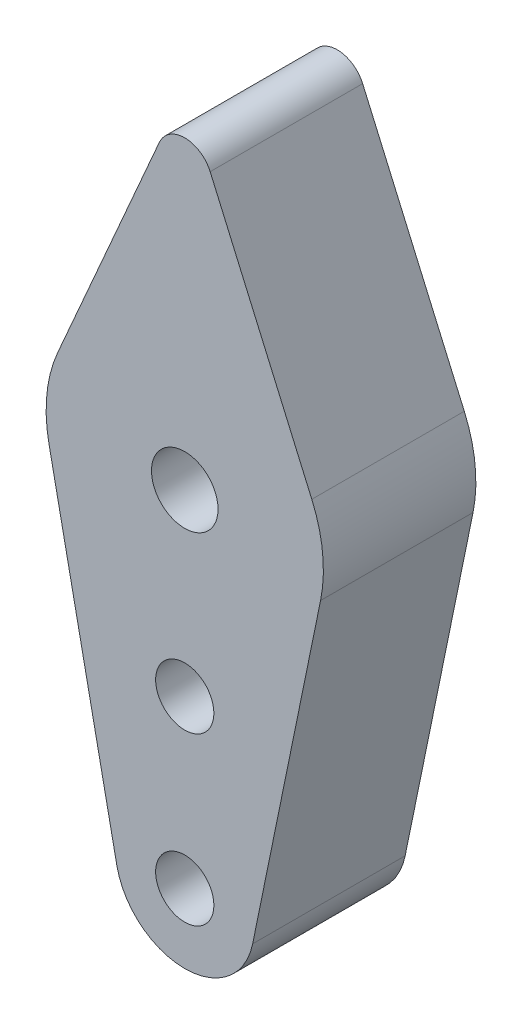
ISO-10303-21;
HEADER;
FILE_DESCRIPTION(('STEP AP214'),'2;1');
FILE_NAME('part.step','',(''),(''),'','','');
FILE_SCHEMA(('AUTOMOTIVE_DESIGN { 1 0 10303 214 1 1 1 1 }'));
ENDSEC;
DATA;
#1=APPLICATION_CONTEXT('core data for automotive mechanical design processes');
#2=APPLICATION_PROTOCOL_DEFINITION('international standard','automotive_design',2000,#1);
#3=PRODUCT_CONTEXT('',#1,'mechanical');
#4=PRODUCT('Part','Part','',(#3));
#5=PRODUCT_RELATED_PRODUCT_CATEGORY('part','',(#4));
#6=PRODUCT_DEFINITION_FORMATION('','',#4);
#7=PRODUCT_DEFINITION_CONTEXT('part definition',#1,'design');
#8=PRODUCT_DEFINITION('design','',#6,#7);
#9=PRODUCT_DEFINITION_SHAPE('','',#8);
#10=(LENGTH_UNIT() NAMED_UNIT(*) SI_UNIT(.MILLI.,.METRE.));
#11=(NAMED_UNIT(*) PLANE_ANGLE_UNIT() SI_UNIT($,.RADIAN.));
#12=(NAMED_UNIT(*) SI_UNIT($,.STERADIAN.) SOLID_ANGLE_UNIT());
#13=UNCERTAINTY_MEASURE_WITH_UNIT(LENGTH_MEASURE(1.E-05),#10,'distance_accuracy_value','');
#14=(GEOMETRIC_REPRESENTATION_CONTEXT(3) GLOBAL_UNCERTAINTY_ASSIGNED_CONTEXT((#13)) GLOBAL_UNIT_ASSIGNED_CONTEXT((#10,
#11,#12)) REPRESENTATION_CONTEXT('',''));
#15=CARTESIAN_POINT('',(0.,0.,0.));
#16=DIRECTION('',(0.,0.,1.));
#17=DIRECTION('',(1.,0.,0.));
#18=AXIS2_PLACEMENT_3D('',#15,#16,#17);
#19=CARTESIAN_POINT('',(0.,0.,5.5));
#20=DIRECTION('',(0.,0.,1.));
#21=DIRECTION('',(1.,0.,0.));
#22=AXIS2_PLACEMENT_3D('',#19,#20,#21);
#23=PLANE('',#22);
#24=CARTESIAN_POINT('',(0.,-12.45,5.5));
#25=DIRECTION('',(0.,0.,1.));
#26=DIRECTION('',(1.,0.,0.));
#27=AXIS2_PLACEMENT_3D('',#24,#25,#26);
#28=CIRCLE('',#27,1.05);
#29=CARTESIAN_POINT('',(1.05,-12.45,5.5));
#30=VERTEX_POINT('',#29);
#31=EDGE_CURVE('E184',#30,#30,#28,.T.);
#32=ORIENTED_EDGE('',*,*,#31,.F.);
#33=EDGE_LOOP('',(#32));
#34=FACE_BOUND('',#33,.T.);
#35=CARTESIAN_POINT('',(0.,0.,5.5));
#36=DIRECTION('',(0.,0.,1.));
#37=DIRECTION('',(1.,0.,0.));
#38=AXIS2_PLACEMENT_3D('',#35,#36,#37);
#39=CIRCLE('',#38,5.);
#40=CARTESIAN_POINT('',(-4.58257569495584,2.,5.5));
#41=VERTEX_POINT('',#40);
#42=CARTESIAN_POINT('',(-4.8981579948705,-1.00401606425703,5.5));
#43=VERTEX_POINT('',#42);
#44=EDGE_CURVE('E147',#41,#43,#39,.T.);
#45=ORIENTED_EDGE('',*,*,#44,.T.);
#46=DIRECTION('',(0.200803212851406,-0.979631598974101,0.));
#47=VECTOR('',#46,1.);
#48=CARTESIAN_POINT('',(-2.44907899743525,-12.9520080321285,5.5));
#49=LINE('',#48,#47);
#50=CARTESIAN_POINT('',(-2.44907899743525,-12.9520080321285,5.5));
#51=VERTEX_POINT('',#50);
#52=EDGE_CURVE('E95',#43,#51,#49,.T.);
#53=ORIENTED_EDGE('',*,*,#52,.T.);
#54=CARTESIAN_POINT('',(0.,-12.45,5.5));
#55=DIRECTION('',(0.,0.,1.));
#56=DIRECTION('',(1.,0.,0.));
#57=AXIS2_PLACEMENT_3D('',#54,#55,#56);
#58=CIRCLE('',#57,2.5);
#59=CARTESIAN_POINT('',(2.44907899743525,-12.9520080321285,5.5));
#60=VERTEX_POINT('',#59);
#61=EDGE_CURVE('E162',#51,#60,#58,.T.);
#62=ORIENTED_EDGE('',*,*,#61,.T.);
#63=DIRECTION('',(0.200803212851406,0.979631598974101,0.));
#64=VECTOR('',#63,1.);
#65=CARTESIAN_POINT('',(2.44907899743525,-12.9520080321285,5.5));
#66=LINE('',#65,#64);
#67=CARTESIAN_POINT('',(4.8981579948705,-1.00401606425703,5.5));
#68=VERTEX_POINT('',#67);
#69=EDGE_CURVE('E175',#60,#68,#66,.T.);
#70=ORIENTED_EDGE('',*,*,#69,.T.);
#71=CARTESIAN_POINT('',(0.,0.,5.5));
#72=DIRECTION('',(0.,0.,1.));
#73=DIRECTION('',(1.,0.,0.));
#74=AXIS2_PLACEMENT_3D('',#71,#72,#73);
#75=CIRCLE('',#74,5.);
#76=CARTESIAN_POINT('',(4.58257569495584,2.,5.5));
#77=VERTEX_POINT('',#76);
#78=EDGE_CURVE('E114',#68,#77,#75,.T.);
#79=ORIENTED_EDGE('',*,*,#78,.T.);
#80=DIRECTION('',(-0.4,0.916515138991168,0.));
#81=VECTOR('',#80,1.);
#82=CARTESIAN_POINT('',(4.58257569495584,2.,5.5));
#83=LINE('',#82,#81);
#84=CARTESIAN_POINT('',(0.916515138991168,10.4,5.5));
#85=VERTEX_POINT('',#84);
#86=EDGE_CURVE('E108',#77,#85,#83,.T.);
#87=ORIENTED_EDGE('',*,*,#86,.T.);
#88=CARTESIAN_POINT('',(0.,10.,5.5));
#89=DIRECTION('',(0.,0.,1.));
#90=DIRECTION('',(-1.,0.,0.));
#91=AXIS2_PLACEMENT_3D('',#88,#89,#90);
#92=CIRCLE('',#91,1.);
#93=CARTESIAN_POINT('',(-0.916515138991168,10.4,5.5));
#94=VERTEX_POINT('',#93);
#95=EDGE_CURVE('E112',#85,#94,#92,.T.);
#96=ORIENTED_EDGE('',*,*,#95,.T.);
#97=DIRECTION('',(-0.4,-0.916515138991168,0.));
#98=VECTOR('',#97,1.);
#99=CARTESIAN_POINT('',(-4.58257569495584,2.,5.5));
#100=LINE('',#99,#98);
#101=EDGE_CURVE('E52',#94,#41,#100,.T.);
#102=ORIENTED_EDGE('',*,*,#101,.T.);
#103=EDGE_LOOP('',(#45,#53,#62,#70,#79,#87,#96,#102));
#104=FACE_BOUND('',#103,.T.);
#105=CARTESIAN_POINT('',(0.,-6.45,5.5));
#106=DIRECTION('',(0.,0.,1.));
#107=DIRECTION('',(1.,0.,0.));
#108=AXIS2_PLACEMENT_3D('',#105,#106,#107);
#109=CIRCLE('',#108,1.05);
#110=CARTESIAN_POINT('',(1.05,-6.45,5.5));
#111=VERTEX_POINT('',#110);
#112=EDGE_CURVE('E136',#111,#111,#109,.T.);
#113=ORIENTED_EDGE('',*,*,#112,.F.);
#114=EDGE_LOOP('',(#113));
#115=FACE_BOUND('',#114,.T.);
#116=CARTESIAN_POINT('',(0.,0.,5.5));
#117=DIRECTION('',(0.,0.,1.));
#118=DIRECTION('',(1.,0.,0.));
#119=AXIS2_PLACEMENT_3D('',#116,#117,#118);
#120=CIRCLE('',#119,1.2);
#121=CARTESIAN_POINT('',(1.2,0.,5.5));
#122=VERTEX_POINT('',#121);
#123=EDGE_CURVE('E190',#122,#122,#120,.T.);
#124=ORIENTED_EDGE('',*,*,#123,.F.);
#125=EDGE_LOOP('',(#124));
#126=FACE_BOUND('',#125,.T.);
#127=ADVANCED_FACE('F35',(#34,#104,#115,#126),#23,.T.);
#128=CARTESIAN_POINT('',(0.,0.,0.));
#129=DIRECTION('',(0.,0.,1.));
#130=DIRECTION('',(1.,0.,0.));
#131=AXIS2_PLACEMENT_3D('',#128,#129,#130);
#132=PLANE('',#131);
#133=CARTESIAN_POINT('',(0.,0.,0.));
#134=DIRECTION('',(0.,0.,1.));
#135=DIRECTION('',(1.,0.,0.));
#136=AXIS2_PLACEMENT_3D('',#133,#134,#135);
#137=CIRCLE('',#136,5.);
#138=CARTESIAN_POINT('',(-4.58257569495584,2.,0.));
#139=VERTEX_POINT('',#138);
#140=CARTESIAN_POINT('',(-4.8981579948705,-1.00401606425703,0.));
#141=VERTEX_POINT('',#140);
#142=EDGE_CURVE('E132',#139,#141,#137,.T.);
#143=ORIENTED_EDGE('',*,*,#142,.F.);
#144=DIRECTION('',(-0.4,-0.916515138991168,0.));
#145=VECTOR('',#144,1.);
#146=CARTESIAN_POINT('',(-4.58257569495584,2.,0.));
#147=LINE('',#146,#145);
#148=CARTESIAN_POINT('',(-0.916515138991168,10.4,0.));
#149=VERTEX_POINT('',#148);
#150=EDGE_CURVE('E87',#149,#139,#147,.T.);
#151=ORIENTED_EDGE('',*,*,#150,.F.);
#152=CARTESIAN_POINT('',(0.,10.,0.));
#153=DIRECTION('',(0.,0.,1.));
#154=DIRECTION('',(-1.,0.,0.));
#155=AXIS2_PLACEMENT_3D('',#152,#153,#154);
#156=CIRCLE('',#155,1.);
#157=CARTESIAN_POINT('',(0.916515138991168,10.4,0.));
#158=VERTEX_POINT('',#157);
#159=EDGE_CURVE('E81',#158,#149,#156,.T.);
#160=ORIENTED_EDGE('',*,*,#159,.F.);
#161=DIRECTION('',(-0.4,0.916515138991168,0.));
#162=VECTOR('',#161,1.);
#163=CARTESIAN_POINT('',(4.58257569495584,2.,0.));
#164=LINE('',#163,#162);
#165=CARTESIAN_POINT('',(4.58257569495584,2.,0.));
#166=VERTEX_POINT('',#165);
#167=EDGE_CURVE('E122',#166,#158,#164,.T.);
#168=ORIENTED_EDGE('',*,*,#167,.F.);
#169=CARTESIAN_POINT('',(0.,0.,0.));
#170=DIRECTION('',(0.,0.,1.));
#171=DIRECTION('',(1.,0.,0.));
#172=AXIS2_PLACEMENT_3D('',#169,#170,#171);
#173=CIRCLE('',#172,5.);
#174=CARTESIAN_POINT('',(4.8981579948705,-1.00401606425703,0.));
#175=VERTEX_POINT('',#174);
#176=EDGE_CURVE('E142',#175,#166,#173,.T.);
#177=ORIENTED_EDGE('',*,*,#176,.F.);
#178=DIRECTION('',(0.200803212851406,0.979631598974101,0.));
#179=VECTOR('',#178,1.);
#180=CARTESIAN_POINT('',(2.44907899743525,-12.9520080321285,0.));
#181=LINE('',#180,#179);
#182=CARTESIAN_POINT('',(2.44907899743525,-12.9520080321285,0.));
#183=VERTEX_POINT('',#182);
#184=EDGE_CURVE('E140',#183,#175,#181,.T.);
#185=ORIENTED_EDGE('',*,*,#184,.F.);
#186=CARTESIAN_POINT('',(0.,-12.45,0.));
#187=DIRECTION('',(0.,0.,1.));
#188=DIRECTION('',(1.,0.,0.));
#189=AXIS2_PLACEMENT_3D('',#186,#187,#188);
#190=CIRCLE('',#189,2.5);
#191=CARTESIAN_POINT('',(-2.44907899743525,-12.9520080321285,0.));
#192=VERTEX_POINT('',#191);
#193=EDGE_CURVE('E138',#192,#183,#190,.T.);
#194=ORIENTED_EDGE('',*,*,#193,.F.);
#195=DIRECTION('',(0.200803212851406,-0.979631598974101,0.));
#196=VECTOR('',#195,1.);
#197=CARTESIAN_POINT('',(-2.44907899743525,-12.9520080321285,0.));
#198=LINE('',#197,#196);
#199=EDGE_CURVE('E135',#141,#192,#198,.T.);
#200=ORIENTED_EDGE('',*,*,#199,.F.);
#201=EDGE_LOOP('',(#143,#151,#160,#168,#177,#185,#194,#200));
#202=FACE_BOUND('',#201,.T.);
#203=CARTESIAN_POINT('',(0.,-6.45,0.));
#204=DIRECTION('',(0.,0.,1.));
#205=DIRECTION('',(1.,0.,0.));
#206=AXIS2_PLACEMENT_3D('',#203,#204,#205);
#207=CIRCLE('',#206,1.05);
#208=CARTESIAN_POINT('',(1.05,-6.45,0.));
#209=VERTEX_POINT('',#208);
#210=EDGE_CURVE('E181',#209,#209,#207,.T.);
#211=ORIENTED_EDGE('',*,*,#210,.T.);
#212=EDGE_LOOP('',(#211));
#213=FACE_BOUND('',#212,.T.);
#214=CARTESIAN_POINT('',(0.,-12.45,0.));
#215=DIRECTION('',(0.,0.,1.));
#216=DIRECTION('',(1.,0.,0.));
#217=AXIS2_PLACEMENT_3D('',#214,#215,#216);
#218=CIRCLE('',#217,1.05);
#219=CARTESIAN_POINT('',(1.05,-12.45,0.));
#220=VERTEX_POINT('',#219);
#221=EDGE_CURVE('E187',#220,#220,#218,.T.);
#222=ORIENTED_EDGE('',*,*,#221,.T.);
#223=EDGE_LOOP('',(#222));
#224=FACE_BOUND('',#223,.T.);
#225=CARTESIAN_POINT('',(0.,0.,0.));
#226=DIRECTION('',(0.,0.,1.));
#227=DIRECTION('',(1.,0.,0.));
#228=AXIS2_PLACEMENT_3D('',#225,#226,#227);
#229=CIRCLE('',#228,1.2);
#230=CARTESIAN_POINT('',(1.2,0.,0.));
#231=VERTEX_POINT('',#230);
#232=EDGE_CURVE('E193',#231,#231,#229,.T.);
#233=ORIENTED_EDGE('',*,*,#232,.T.);
#234=EDGE_LOOP('',(#233));
#235=FACE_BOUND('',#234,.T.);
#236=ADVANCED_FACE('F166',(#202,#213,#224,#235),#132,.F.);
#237=CARTESIAN_POINT('',(0.,0.,5.5));
#238=DIRECTION('',(0.,0.,-1.));
#239=DIRECTION('',(-1.,0.,0.));
#240=AXIS2_PLACEMENT_3D('',#237,#238,#239);
#241=CYLINDRICAL_SURFACE('',#240,5.);
#242=ORIENTED_EDGE('',*,*,#142,.T.);
#243=DIRECTION('',(0.,0.,-1.));
#244=VECTOR('',#243,1.);
#245=CARTESIAN_POINT('',(-4.8981579948705,-1.00401606425703,5.5));
#246=LINE('',#245,#244);
#247=EDGE_CURVE('E11',#43,#141,#246,.T.);
#248=ORIENTED_EDGE('',*,*,#247,.F.);
#249=ORIENTED_EDGE('',*,*,#44,.F.);
#250=DIRECTION('',(0.,0.,-1.));
#251=VECTOR('',#250,1.);
#252=CARTESIAN_POINT('',(-4.58257569495584,2.,5.5));
#253=LINE('',#252,#251);
#254=EDGE_CURVE('E128',#41,#139,#253,.T.);
#255=ORIENTED_EDGE('',*,*,#254,.T.);
#256=EDGE_LOOP('',(#242,#248,#249,#255));
#257=FACE_BOUND('',#256,.T.);
#258=ADVANCED_FACE('F37',(#257),#241,.T.);
#259=CARTESIAN_POINT('',(-2.44907899743525,-12.9520080321285,5.5));
#260=DIRECTION('',(0.979631598974101,0.200803212851406,0.));
#261=DIRECTION('',(-0.200803212851406,0.979631598974101,0.));
#262=AXIS2_PLACEMENT_3D('',#259,#260,#261);
#263=PLANE('',#262);
#264=ORIENTED_EDGE('',*,*,#199,.T.);
#265=DIRECTION('',(0.,0.,-1.));
#266=VECTOR('',#265,1.);
#267=CARTESIAN_POINT('',(-2.44907899743525,-12.9520080321285,5.5));
#268=LINE('',#267,#266);
#269=EDGE_CURVE('E44',#51,#192,#268,.T.);
#270=ORIENTED_EDGE('',*,*,#269,.F.);
#271=ORIENTED_EDGE('',*,*,#52,.F.);
#272=ORIENTED_EDGE('',*,*,#247,.T.);
#273=EDGE_LOOP('',(#264,#270,#271,#272));
#274=FACE_BOUND('',#273,.T.);
#275=ADVANCED_FACE('F226',(#274),#263,.F.);
#276=CARTESIAN_POINT('',(0.,-12.45,5.5));
#277=DIRECTION('',(0.,0.,-1.));
#278=DIRECTION('',(-1.,0.,0.));
#279=AXIS2_PLACEMENT_3D('',#276,#277,#278);
#280=CYLINDRICAL_SURFACE('',#279,2.5);
#281=ORIENTED_EDGE('',*,*,#193,.T.);
#282=DIRECTION('',(0.,0.,-1.));
#283=VECTOR('',#282,1.);
#284=CARTESIAN_POINT('',(2.44907899743525,-12.9520080321285,5.5));
#285=LINE('',#284,#283);
#286=EDGE_CURVE('E154',#60,#183,#285,.T.);
#287=ORIENTED_EDGE('',*,*,#286,.F.);
#288=ORIENTED_EDGE('',*,*,#61,.F.);
#289=ORIENTED_EDGE('',*,*,#269,.T.);
#290=EDGE_LOOP('',(#281,#287,#288,#289));
#291=FACE_BOUND('',#290,.T.);
#292=ADVANCED_FACE('F160',(#291),#280,.T.);
#293=CARTESIAN_POINT('',(2.44907899743525,-12.9520080321285,5.5));
#294=DIRECTION('',(-0.979631598974101,0.200803212851406,0.));
#295=DIRECTION('',(-0.200803212851406,-0.979631598974101,0.));
#296=AXIS2_PLACEMENT_3D('',#293,#294,#295);
#297=PLANE('',#296);
#298=ORIENTED_EDGE('',*,*,#184,.T.);
#299=DIRECTION('',(0.,0.,-1.));
#300=VECTOR('',#299,1.);
#301=CARTESIAN_POINT('',(4.8981579948705,-1.00401606425703,5.5));
#302=LINE('',#301,#300);
#303=EDGE_CURVE('E151',#68,#175,#302,.T.);
#304=ORIENTED_EDGE('',*,*,#303,.F.);
#305=ORIENTED_EDGE('',*,*,#69,.F.);
#306=ORIENTED_EDGE('',*,*,#286,.T.);
#307=EDGE_LOOP('',(#298,#304,#305,#306));
#308=FACE_BOUND('',#307,.T.);
#309=ADVANCED_FACE('F171',(#308),#297,.F.);
#310=CARTESIAN_POINT('',(0.,0.,5.5));
#311=DIRECTION('',(0.,0.,-1.));
#312=DIRECTION('',(-1.,0.,0.));
#313=AXIS2_PLACEMENT_3D('',#310,#311,#312);
#314=CYLINDRICAL_SURFACE('',#313,5.);
#315=ORIENTED_EDGE('',*,*,#176,.T.);
#316=DIRECTION('',(0.,0.,-1.));
#317=VECTOR('',#316,1.);
#318=CARTESIAN_POINT('',(4.58257569495584,2.,5.5));
#319=LINE('',#318,#317);
#320=EDGE_CURVE('E123',#77,#166,#319,.T.);
#321=ORIENTED_EDGE('',*,*,#320,.F.);
#322=ORIENTED_EDGE('',*,*,#78,.F.);
#323=ORIENTED_EDGE('',*,*,#303,.T.);
#324=EDGE_LOOP('',(#315,#321,#322,#323));
#325=FACE_BOUND('',#324,.T.);
#326=ADVANCED_FACE('F174',(#325),#314,.T.);
#327=CARTESIAN_POINT('',(4.58257569495584,2.,5.5));
#328=DIRECTION('',(-0.916515138991168,-0.4,0.));
#329=DIRECTION('',(0.4,-0.916515138991168,0.));
#330=AXIS2_PLACEMENT_3D('',#327,#328,#329);
#331=PLANE('',#330);
#332=ORIENTED_EDGE('',*,*,#167,.T.);
#333=DIRECTION('',(0.,0.,-1.));
#334=VECTOR('',#333,1.);
#335=CARTESIAN_POINT('',(0.916515138991168,10.4,5.5));
#336=LINE('',#335,#334);
#337=EDGE_CURVE('E119',#85,#158,#336,.T.);
#338=ORIENTED_EDGE('',*,*,#337,.F.);
#339=ORIENTED_EDGE('',*,*,#86,.F.);
#340=ORIENTED_EDGE('',*,*,#320,.T.);
#341=EDGE_LOOP('',(#332,#338,#339,#340));
#342=FACE_BOUND('',#341,.T.);
#343=ADVANCED_FACE('F120',(#342),#331,.F.);
#344=CARTESIAN_POINT('',(0.,10.,5.5));
#345=DIRECTION('',(0.,0.,-1.));
#346=DIRECTION('',(-1.,0.,0.));
#347=AXIS2_PLACEMENT_3D('',#344,#345,#346);
#348=CYLINDRICAL_SURFACE('',#347,1.);
#349=ORIENTED_EDGE('',*,*,#159,.T.);
#350=DIRECTION('',(0.,0.,-1.));
#351=VECTOR('',#350,1.);
#352=CARTESIAN_POINT('',(-0.916515138991168,10.4,5.5));
#353=LINE('',#352,#351);
#354=EDGE_CURVE('E124',#94,#149,#353,.T.);
#355=ORIENTED_EDGE('',*,*,#354,.F.);
#356=ORIENTED_EDGE('',*,*,#95,.F.);
#357=ORIENTED_EDGE('',*,*,#337,.T.);
#358=EDGE_LOOP('',(#349,#355,#356,#357));
#359=FACE_BOUND('',#358,.T.);
#360=ADVANCED_FACE('F126',(#359),#348,.T.);
#361=CARTESIAN_POINT('',(-4.58257569495584,2.,5.5));
#362=DIRECTION('',(0.916515138991168,-0.4,0.));
#363=DIRECTION('',(0.4,0.916515138991168,0.));
#364=AXIS2_PLACEMENT_3D('',#361,#362,#363);
#365=PLANE('',#364);
#366=ORIENTED_EDGE('',*,*,#150,.T.);
#367=ORIENTED_EDGE('',*,*,#254,.F.);
#368=ORIENTED_EDGE('',*,*,#101,.F.);
#369=ORIENTED_EDGE('',*,*,#354,.T.);
#370=EDGE_LOOP('',(#366,#367,#368,#369));
#371=FACE_BOUND('',#370,.T.);
#372=ADVANCED_FACE('F214',(#371),#365,.F.);
#373=CARTESIAN_POINT('',(0.,-6.45,5.5));
#374=DIRECTION('',(0.,0.,-1.));
#375=DIRECTION('',(-1.,0.,0.));
#376=AXIS2_PLACEMENT_3D('',#373,#374,#375);
#377=CYLINDRICAL_SURFACE('',#376,1.05);
#378=ORIENTED_EDGE('',*,*,#112,.T.);
#379=EDGE_LOOP('',(#378));
#380=FACE_BOUND('',#379,.T.);
#381=ORIENTED_EDGE('',*,*,#210,.F.);
#382=EDGE_LOOP('',(#381));
#383=FACE_BOUND('',#382,.T.);
#384=ADVANCED_FACE('F211',(#380,#383),#377,.F.);
#385=CARTESIAN_POINT('',(0.,-12.45,5.5));
#386=DIRECTION('',(0.,0.,-1.));
#387=DIRECTION('',(-1.,0.,0.));
#388=AXIS2_PLACEMENT_3D('',#385,#386,#387);
#389=CYLINDRICAL_SURFACE('',#388,1.05);
#390=ORIENTED_EDGE('',*,*,#31,.T.);
#391=EDGE_LOOP('',(#390));
#392=FACE_BOUND('',#391,.T.);
#393=ORIENTED_EDGE('',*,*,#221,.F.);
#394=EDGE_LOOP('',(#393));
#395=FACE_BOUND('',#394,.T.);
#396=ADVANCED_FACE('F290',(#392,#395),#389,.F.);
#397=CARTESIAN_POINT('',(0.,0.,5.5));
#398=DIRECTION('',(0.,0.,-1.));
#399=DIRECTION('',(-1.,0.,0.));
#400=AXIS2_PLACEMENT_3D('',#397,#398,#399);
#401=CYLINDRICAL_SURFACE('',#400,1.2);
#402=ORIENTED_EDGE('',*,*,#123,.T.);
#403=EDGE_LOOP('',(#402));
#404=FACE_BOUND('',#403,.T.);
#405=ORIENTED_EDGE('',*,*,#232,.F.);
#406=EDGE_LOOP('',(#405));
#407=FACE_BOUND('',#406,.T.);
#408=ADVANCED_FACE('F199',(#404,#407),#401,.F.);
#409=CLOSED_SHELL('',(#127,#236,#258,#275,#292,#309,#326,#343,#360,#372,#384,#396,#408));
#410=MANIFOLD_SOLID_BREP('B2',#409);
#411=ADVANCED_BREP_SHAPE_REPRESENTATION('',(#18,#410),#14);
#412=SHAPE_DEFINITION_REPRESENTATION(#9,#411);
ENDSEC;
END-ISO-10303-21;
